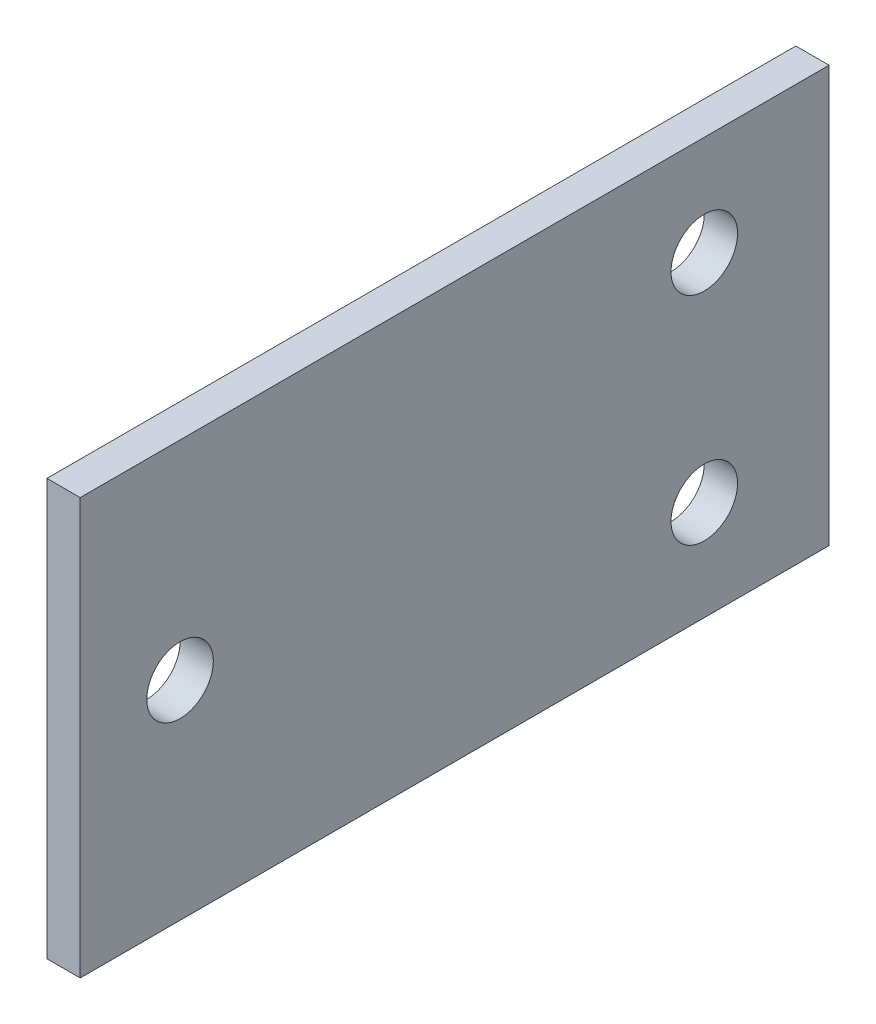
ISO-10303-21;
HEADER;
FILE_DESCRIPTION(('STEP AP214'),'2;1');
FILE_NAME('part.step','',(''),(''),'','','');
FILE_SCHEMA(('AUTOMOTIVE_DESIGN { 1 0 10303 214 1 1 1 1 }'));
ENDSEC;
DATA;
#1=APPLICATION_CONTEXT('core data for automotive mechanical design processes');
#2=APPLICATION_PROTOCOL_DEFINITION('international standard','automotive_design',2000,#1);
#3=PRODUCT_CONTEXT('',#1,'mechanical');
#4=PRODUCT('Part','Part','',(#3));
#5=PRODUCT_RELATED_PRODUCT_CATEGORY('part','',(#4));
#6=PRODUCT_DEFINITION_FORMATION('','',#4);
#7=PRODUCT_DEFINITION_CONTEXT('part definition',#1,'design');
#8=PRODUCT_DEFINITION('design','',#6,#7);
#9=PRODUCT_DEFINITION_SHAPE('','',#8);
#10=(LENGTH_UNIT() NAMED_UNIT(*) SI_UNIT(.MILLI.,.METRE.));
#11=(NAMED_UNIT(*) PLANE_ANGLE_UNIT() SI_UNIT($,.RADIAN.));
#12=(NAMED_UNIT(*) SI_UNIT($,.STERADIAN.) SOLID_ANGLE_UNIT());
#13=UNCERTAINTY_MEASURE_WITH_UNIT(LENGTH_MEASURE(1.E-05),#10,'distance_accuracy_value','');
#14=(GEOMETRIC_REPRESENTATION_CONTEXT(3) GLOBAL_UNCERTAINTY_ASSIGNED_CONTEXT((#13)) GLOBAL_UNIT_ASSIGNED_CONTEXT((#10,
#11,#12)) REPRESENTATION_CONTEXT('',''));
#15=CARTESIAN_POINT('',(0.,0.,0.));
#16=DIRECTION('',(0.,0.,1.));
#17=DIRECTION('',(1.,0.,0.));
#18=AXIS2_PLACEMENT_3D('',#15,#16,#17);
#19=CARTESIAN_POINT('',(-2.,50.,45.));
#20=DIRECTION('',(1.,0.,0.));
#21=DIRECTION('',(0.,0.,-1.));
#22=AXIS2_PLACEMENT_3D('',#19,#20,#21);
#23=PLANE('',#22);
#24=CARTESIAN_POINT('',(-2.,25.,33.));
#25=DIRECTION('',(1.,0.,0.));
#26=DIRECTION('',(0.,0.,-1.));
#27=AXIS2_PLACEMENT_3D('',#24,#25,#26);
#28=CIRCLE('',#27,4.);
#29=CARTESIAN_POINT('',(-2.,25.,29.));
#30=VERTEX_POINT('',#29);
#31=EDGE_CURVE('E102',#30,#30,#28,.T.);
#32=ORIENTED_EDGE('',*,*,#31,.T.);
#33=EDGE_LOOP('',(#32));
#34=FACE_BOUND('',#33,.T.);
#35=CARTESIAN_POINT('',(-2.,38.,-30.));
#36=DIRECTION('',(1.,0.,0.));
#37=DIRECTION('',(0.,0.,-1.));
#38=AXIS2_PLACEMENT_3D('',#35,#36,#37);
#39=CIRCLE('',#38,4.00000000000001);
#40=CARTESIAN_POINT('',(-2.,38.,-34.));
#41=VERTEX_POINT('',#40);
#42=EDGE_CURVE('E115',#41,#41,#39,.T.);
#43=ORIENTED_EDGE('',*,*,#42,.T.);
#44=EDGE_LOOP('',(#43));
#45=FACE_BOUND('',#44,.T.);
#46=CARTESIAN_POINT('',(-2.,12.,-30.));
#47=DIRECTION('',(1.,0.,0.));
#48=DIRECTION('',(0.,0.,-1.));
#49=AXIS2_PLACEMENT_3D('',#46,#47,#48);
#50=CIRCLE('',#49,4.00000000000001);
#51=CARTESIAN_POINT('',(-2.,12.,-34.));
#52=VERTEX_POINT('',#51);
#53=EDGE_CURVE('E118',#52,#52,#50,.T.);
#54=ORIENTED_EDGE('',*,*,#53,.T.);
#55=EDGE_LOOP('',(#54));
#56=FACE_BOUND('',#55,.T.);
#57=DIRECTION('',(0.,0.,1.));
#58=VECTOR('',#57,1.);
#59=CARTESIAN_POINT('',(-2.,0.,45.));
#60=LINE('',#59,#58);
#61=CARTESIAN_POINT('',(-2.,0.,-45.));
#62=VERTEX_POINT('',#61);
#63=CARTESIAN_POINT('',(-2.,0.,45.));
#64=VERTEX_POINT('',#63);
#65=EDGE_CURVE('E99',#62,#64,#60,.T.);
#66=ORIENTED_EDGE('',*,*,#65,.T.);
#67=DIRECTION('',(0.,-1.,0.));
#68=VECTOR('',#67,1.);
#69=CARTESIAN_POINT('',(-2.,50.,45.));
#70=LINE('',#69,#68);
#71=CARTESIAN_POINT('',(-2.,50.,45.));
#72=VERTEX_POINT('',#71);
#73=EDGE_CURVE('E11',#72,#64,#70,.T.);
#74=ORIENTED_EDGE('',*,*,#73,.F.);
#75=DIRECTION('',(0.,0.,1.));
#76=VECTOR('',#75,1.);
#77=CARTESIAN_POINT('',(-2.,50.,45.));
#78=LINE('',#77,#76);
#79=CARTESIAN_POINT('',(-2.,50.,-45.));
#80=VERTEX_POINT('',#79);
#81=EDGE_CURVE('E87',#80,#72,#78,.T.);
#82=ORIENTED_EDGE('',*,*,#81,.F.);
#83=DIRECTION('',(0.,-1.,0.));
#84=VECTOR('',#83,1.);
#85=CARTESIAN_POINT('',(-2.,50.,-45.));
#86=LINE('',#85,#84);
#87=EDGE_CURVE('E95',#80,#62,#86,.T.);
#88=ORIENTED_EDGE('',*,*,#87,.T.);
#89=EDGE_LOOP('',(#66,#74,#82,#88));
#90=FACE_BOUND('',#89,.T.);
#91=ADVANCED_FACE('F36',(#34,#45,#56,#90),#23,.F.);
#92=CARTESIAN_POINT('',(2.,50.,45.));
#93=DIRECTION('',(0.,0.,-1.));
#94=DIRECTION('',(-1.,0.,0.));
#95=AXIS2_PLACEMENT_3D('',#92,#93,#94);
#96=PLANE('',#95);
#97=DIRECTION('',(1.,0.,0.));
#98=VECTOR('',#97,1.);
#99=CARTESIAN_POINT('',(2.,0.,45.));
#100=LINE('',#99,#98);
#101=CARTESIAN_POINT('',(2.,0.,45.));
#102=VERTEX_POINT('',#101);
#103=EDGE_CURVE('E91',#64,#102,#100,.T.);
#104=ORIENTED_EDGE('',*,*,#103,.T.);
#105=DIRECTION('',(0.,-1.,0.));
#106=VECTOR('',#105,1.);
#107=CARTESIAN_POINT('',(2.,50.,45.));
#108=LINE('',#107,#106);
#109=CARTESIAN_POINT('',(2.,50.,45.));
#110=VERTEX_POINT('',#109);
#111=EDGE_CURVE('E44',#110,#102,#108,.T.);
#112=ORIENTED_EDGE('',*,*,#111,.F.);
#113=DIRECTION('',(1.,0.,0.));
#114=VECTOR('',#113,1.);
#115=CARTESIAN_POINT('',(2.,50.,45.));
#116=LINE('',#115,#114);
#117=EDGE_CURVE('E82',#72,#110,#116,.T.);
#118=ORIENTED_EDGE('',*,*,#117,.F.);
#119=ORIENTED_EDGE('',*,*,#73,.T.);
#120=EDGE_LOOP('',(#104,#112,#118,#119));
#121=FACE_BOUND('',#120,.T.);
#122=ADVANCED_FACE('F90',(#121),#96,.F.);
#123=CARTESIAN_POINT('',(2.,50.,45.));
#124=DIRECTION('',(-1.,0.,0.));
#125=DIRECTION('',(0.,0.,1.));
#126=AXIS2_PLACEMENT_3D('',#123,#124,#125);
#127=PLANE('',#126);
#128=CARTESIAN_POINT('',(2.,25.,33.));
#129=DIRECTION('',(1.,0.,0.));
#130=DIRECTION('',(0.,0.,-1.));
#131=AXIS2_PLACEMENT_3D('',#128,#129,#130);
#132=CIRCLE('',#131,4.);
#133=CARTESIAN_POINT('',(2.,25.,29.));
#134=VERTEX_POINT('',#133);
#135=EDGE_CURVE('E121',#134,#134,#132,.T.);
#136=ORIENTED_EDGE('',*,*,#135,.F.);
#137=EDGE_LOOP('',(#136));
#138=FACE_BOUND('',#137,.T.);
#139=CARTESIAN_POINT('',(2.,38.,-30.));
#140=DIRECTION('',(1.,0.,0.));
#141=DIRECTION('',(0.,0.,-1.));
#142=AXIS2_PLACEMENT_3D('',#139,#140,#141);
#143=CIRCLE('',#142,4.00000000000001);
#144=CARTESIAN_POINT('',(2.,38.,-34.));
#145=VERTEX_POINT('',#144);
#146=EDGE_CURVE('E125',#145,#145,#143,.T.);
#147=ORIENTED_EDGE('',*,*,#146,.F.);
#148=EDGE_LOOP('',(#147));
#149=FACE_BOUND('',#148,.T.);
#150=CARTESIAN_POINT('',(2.,12.,-30.));
#151=DIRECTION('',(1.,0.,0.));
#152=DIRECTION('',(0.,0.,-1.));
#153=AXIS2_PLACEMENT_3D('',#150,#151,#152);
#154=CIRCLE('',#153,4.00000000000001);
#155=CARTESIAN_POINT('',(2.,12.,-34.));
#156=VERTEX_POINT('',#155);
#157=EDGE_CURVE('E122',#156,#156,#154,.T.);
#158=ORIENTED_EDGE('',*,*,#157,.F.);
#159=EDGE_LOOP('',(#158));
#160=FACE_BOUND('',#159,.T.);
#161=DIRECTION('',(0.,0.,-1.));
#162=VECTOR('',#161,1.);
#163=CARTESIAN_POINT('',(2.,0.,45.));
#164=LINE('',#163,#162);
#165=CARTESIAN_POINT('',(2.,0.,-45.));
#166=VERTEX_POINT('',#165);
#167=EDGE_CURVE('E69',#102,#166,#164,.T.);
#168=ORIENTED_EDGE('',*,*,#167,.T.);
#169=DIRECTION('',(0.,-1.,0.));
#170=VECTOR('',#169,1.);
#171=CARTESIAN_POINT('',(2.,50.,-45.));
#172=LINE('',#171,#170);
#173=CARTESIAN_POINT('',(2.,50.,-45.));
#174=VERTEX_POINT('',#173);
#175=EDGE_CURVE('E92',#174,#166,#172,.T.);
#176=ORIENTED_EDGE('',*,*,#175,.F.);
#177=DIRECTION('',(0.,0.,-1.));
#178=VECTOR('',#177,1.);
#179=CARTESIAN_POINT('',(2.,50.,45.));
#180=LINE('',#179,#178);
#181=EDGE_CURVE('E85',#110,#174,#180,.T.);
#182=ORIENTED_EDGE('',*,*,#181,.F.);
#183=ORIENTED_EDGE('',*,*,#111,.T.);
#184=EDGE_LOOP('',(#168,#176,#182,#183));
#185=FACE_BOUND('',#184,.T.);
#186=ADVANCED_FACE('F93',(#138,#149,#160,#185),#127,.F.);
#187=CARTESIAN_POINT('',(2.,50.,-45.));
#188=DIRECTION('',(0.,0.,1.));
#189=DIRECTION('',(1.,0.,0.));
#190=AXIS2_PLACEMENT_3D('',#187,#188,#189);
#191=PLANE('',#190);
#192=DIRECTION('',(-1.,0.,0.));
#193=VECTOR('',#192,1.);
#194=CARTESIAN_POINT('',(2.,0.,-45.));
#195=LINE('',#194,#193);
#196=EDGE_CURVE('E75',#166,#62,#195,.T.);
#197=ORIENTED_EDGE('',*,*,#196,.T.);
#198=ORIENTED_EDGE('',*,*,#87,.F.);
#199=DIRECTION('',(-1.,0.,0.));
#200=VECTOR('',#199,1.);
#201=CARTESIAN_POINT('',(2.,50.,-45.));
#202=LINE('',#201,#200);
#203=EDGE_CURVE('E52',#174,#80,#202,.T.);
#204=ORIENTED_EDGE('',*,*,#203,.F.);
#205=ORIENTED_EDGE('',*,*,#175,.T.);
#206=EDGE_LOOP('',(#197,#198,#204,#205));
#207=FACE_BOUND('',#206,.T.);
#208=ADVANCED_FACE('F107',(#207),#191,.F.);
#209=CARTESIAN_POINT('',(0.,50.,0.));
#210=DIRECTION('',(0.,1.,0.));
#211=DIRECTION('',(0.,0.,1.));
#212=AXIS2_PLACEMENT_3D('',#209,#210,#211);
#213=PLANE('',#212);
#214=ORIENTED_EDGE('',*,*,#81,.T.);
#215=ORIENTED_EDGE('',*,*,#117,.T.);
#216=ORIENTED_EDGE('',*,*,#181,.T.);
#217=ORIENTED_EDGE('',*,*,#203,.T.);
#218=EDGE_LOOP('',(#214,#215,#216,#217));
#219=FACE_BOUND('',#218,.T.);
#220=ADVANCED_FACE('F83',(#219),#213,.T.);
#221=CARTESIAN_POINT('',(0.,0.,0.));
#222=DIRECTION('',(0.,1.,0.));
#223=DIRECTION('',(0.,0.,1.));
#224=AXIS2_PLACEMENT_3D('',#221,#222,#223);
#225=PLANE('',#224);
#226=ORIENTED_EDGE('',*,*,#65,.F.);
#227=ORIENTED_EDGE('',*,*,#196,.F.);
#228=ORIENTED_EDGE('',*,*,#167,.F.);
#229=ORIENTED_EDGE('',*,*,#103,.F.);
#230=EDGE_LOOP('',(#226,#227,#228,#229));
#231=FACE_BOUND('',#230,.T.);
#232=ADVANCED_FACE('F110',(#231),#225,.F.);
#233=CARTESIAN_POINT('',(-8.,12.,-30.));
#234=DIRECTION('',(1.,0.,0.));
#235=DIRECTION('',(0.,0.,-1.));
#236=AXIS2_PLACEMENT_3D('',#233,#234,#235);
#237=CYLINDRICAL_SURFACE('',#236,4.00000000000001);
#238=ORIENTED_EDGE('',*,*,#157,.T.);
#239=EDGE_LOOP('',(#238));
#240=FACE_BOUND('',#239,.T.);
#241=ORIENTED_EDGE('',*,*,#53,.F.);
#242=EDGE_LOOP('',(#241));
#243=FACE_BOUND('',#242,.T.);
#244=ADVANCED_FACE('F141',(#240,#243),#237,.F.);
#245=CARTESIAN_POINT('',(-8.,38.,-30.));
#246=DIRECTION('',(1.,0.,0.));
#247=DIRECTION('',(0.,0.,-1.));
#248=AXIS2_PLACEMENT_3D('',#245,#246,#247);
#249=CYLINDRICAL_SURFACE('',#248,4.00000000000001);
#250=ORIENTED_EDGE('',*,*,#146,.T.);
#251=EDGE_LOOP('',(#250));
#252=FACE_BOUND('',#251,.T.);
#253=ORIENTED_EDGE('',*,*,#42,.F.);
#254=EDGE_LOOP('',(#253));
#255=FACE_BOUND('',#254,.T.);
#256=ADVANCED_FACE('F144',(#252,#255),#249,.F.);
#257=CARTESIAN_POINT('',(-8.,25.,33.));
#258=DIRECTION('',(1.,0.,0.));
#259=DIRECTION('',(0.,0.,-1.));
#260=AXIS2_PLACEMENT_3D('',#257,#258,#259);
#261=CYLINDRICAL_SURFACE('',#260,4.);
#262=ORIENTED_EDGE('',*,*,#135,.T.);
#263=EDGE_LOOP('',(#262));
#264=FACE_BOUND('',#263,.T.);
#265=ORIENTED_EDGE('',*,*,#31,.F.);
#266=EDGE_LOOP('',(#265));
#267=FACE_BOUND('',#266,.T.);
#268=ADVANCED_FACE('F131',(#264,#267),#261,.F.);
#269=CLOSED_SHELL('',(#91,#122,#186,#208,#220,#232,#244,#256,#268));
#270=MANIFOLD_SOLID_BREP('B2',#269);
#271=ADVANCED_BREP_SHAPE_REPRESENTATION('',(#18,#270),#14);
#272=SHAPE_DEFINITION_REPRESENTATION(#9,#271);
ENDSEC;
END-ISO-10303-21;
